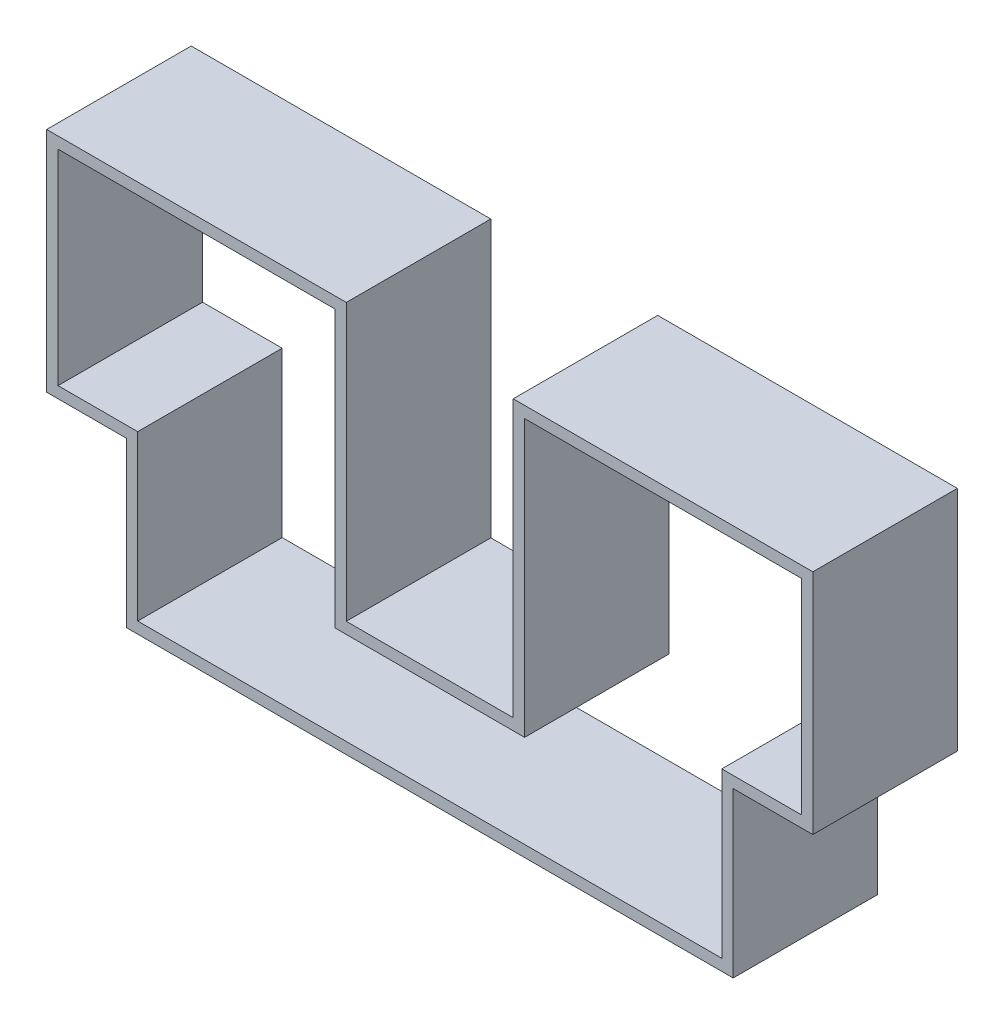
ISO-10303-21;
HEADER;
FILE_DESCRIPTION(('STEP AP214'),'2;1');
FILE_NAME('part.step','',(''),(''),'','','');
FILE_SCHEMA(('AUTOMOTIVE_DESIGN { 1 0 10303 214 1 1 1 1 }'));
ENDSEC;
DATA;
#1=APPLICATION_CONTEXT('core data for automotive mechanical design processes');
#2=APPLICATION_PROTOCOL_DEFINITION('international standard','automotive_design',2000,#1);
#3=PRODUCT_CONTEXT('',#1,'mechanical');
#4=PRODUCT('Part','Part','',(#3));
#5=PRODUCT_RELATED_PRODUCT_CATEGORY('part','',(#4));
#6=PRODUCT_DEFINITION_FORMATION('','',#4);
#7=PRODUCT_DEFINITION_CONTEXT('part definition',#1,'design');
#8=PRODUCT_DEFINITION('design','',#6,#7);
#9=PRODUCT_DEFINITION_SHAPE('','',#8);
#10=(LENGTH_UNIT() NAMED_UNIT(*) SI_UNIT(.MILLI.,.METRE.));
#11=(NAMED_UNIT(*) PLANE_ANGLE_UNIT() SI_UNIT($,.RADIAN.));
#12=(NAMED_UNIT(*) SI_UNIT($,.STERADIAN.) SOLID_ANGLE_UNIT());
#13=UNCERTAINTY_MEASURE_WITH_UNIT(LENGTH_MEASURE(1.E-05),#10,'distance_accuracy_value','');
#14=(GEOMETRIC_REPRESENTATION_CONTEXT(3) GLOBAL_UNCERTAINTY_ASSIGNED_CONTEXT((#13)) GLOBAL_UNIT_ASSIGNED_CONTEXT((#10,
#11,#12)) REPRESENTATION_CONTEXT('',''));
#15=CARTESIAN_POINT('',(0.,0.,0.));
#16=DIRECTION('',(0.,0.,1.));
#17=DIRECTION('',(1.,0.,0.));
#18=AXIS2_PLACEMENT_3D('',#15,#16,#17);
#19=CARTESIAN_POINT('',(0.,0.,38.1));
#20=DIRECTION('',(0.,0.,-1.));
#21=DIRECTION('',(-1.,0.,0.));
#22=AXIS2_PLACEMENT_3D('',#19,#20,#21);
#23=PLANE('',#22);
#24=DIRECTION('',(0.,1.,0.));
#25=VECTOR('',#24,1.);
#26=CARTESIAN_POINT('',(80.,0.,38.1));
#27=LINE('',#26,#25);
#28=CARTESIAN_POINT('',(80.,0.,38.1));
#29=VERTEX_POINT('',#28);
#30=CARTESIAN_POINT('',(80.,43.25,38.1));
#31=VERTEX_POINT('',#30);
#32=EDGE_CURVE('E271',#29,#31,#27,.T.);
#33=ORIENTED_EDGE('',*,*,#32,.T.);
#34=DIRECTION('',(1.,0.,0.));
#35=VECTOR('',#34,1.);
#36=CARTESIAN_POINT('',(80.,43.25,38.1));
#37=LINE('',#36,#35);
#38=CARTESIAN_POINT('',(101.,43.25,38.1));
#39=VERTEX_POINT('',#38);
#40=EDGE_CURVE('E274',#31,#39,#37,.T.);
#41=ORIENTED_EDGE('',*,*,#40,.T.);
#42=DIRECTION('',(0.,1.,0.));
#43=VECTOR('',#42,1.);
#44=CARTESIAN_POINT('',(101.,43.25,38.1));
#45=LINE('',#44,#43);
#46=CARTESIAN_POINT('',(101.,103.25,38.1));
#47=VERTEX_POINT('',#46);
#48=EDGE_CURVE('E277',#39,#47,#45,.T.);
#49=ORIENTED_EDGE('',*,*,#48,.T.);
#50=DIRECTION('',(-1.,0.,0.));
#51=VECTOR('',#50,1.);
#52=CARTESIAN_POINT('',(101.,103.25,38.1));
#53=LINE('',#52,#51);
#54=CARTESIAN_POINT('',(22.006,103.25,38.1));
#55=VERTEX_POINT('',#54);
#56=EDGE_CURVE('E279',#47,#55,#53,.T.);
#57=ORIENTED_EDGE('',*,*,#56,.T.);
#58=DIRECTION('',(0.,-1.,0.));
#59=VECTOR('',#58,1.);
#60=CARTESIAN_POINT('',(22.006,103.25,38.1));
#61=LINE('',#60,#59);
#62=CARTESIAN_POINT('',(22.006,30.4414836809851,38.1));
#63=VERTEX_POINT('',#62);
#64=EDGE_CURVE('E281',#55,#63,#61,.T.);
#65=ORIENTED_EDGE('',*,*,#64,.T.);
#66=DIRECTION('',(-1.,0.,0.));
#67=VECTOR('',#66,1.);
#68=CARTESIAN_POINT('',(-22.006,30.4414836809851,38.1));
#69=LINE('',#68,#67);
#70=CARTESIAN_POINT('',(-22.006,30.4414836809851,38.1));
#71=VERTEX_POINT('',#70);
#72=EDGE_CURVE('E283',#63,#71,#69,.T.);
#73=ORIENTED_EDGE('',*,*,#72,.T.);
#74=DIRECTION('',(0.,1.,0.));
#75=VECTOR('',#74,1.);
#76=CARTESIAN_POINT('',(-22.006,103.25,38.1));
#77=LINE('',#76,#75);
#78=CARTESIAN_POINT('',(-22.006,103.25,38.1));
#79=VERTEX_POINT('',#78);
#80=EDGE_CURVE('E285',#71,#79,#77,.T.);
#81=ORIENTED_EDGE('',*,*,#80,.T.);
#82=DIRECTION('',(-1.,0.,0.));
#83=VECTOR('',#82,1.);
#84=CARTESIAN_POINT('',(-101.,103.25,38.1));
#85=LINE('',#84,#83);
#86=CARTESIAN_POINT('',(-101.,103.25,38.1));
#87=VERTEX_POINT('',#86);
#88=EDGE_CURVE('E287',#79,#87,#85,.T.);
#89=ORIENTED_EDGE('',*,*,#88,.T.);
#90=DIRECTION('',(0.,-1.,0.));
#91=VECTOR('',#90,1.);
#92=CARTESIAN_POINT('',(-101.,43.25,38.1));
#93=LINE('',#92,#91);
#94=CARTESIAN_POINT('',(-101.,43.25,38.1));
#95=VERTEX_POINT('',#94);
#96=EDGE_CURVE('E289',#87,#95,#93,.T.);
#97=ORIENTED_EDGE('',*,*,#96,.T.);
#98=DIRECTION('',(1.,0.,0.));
#99=VECTOR('',#98,1.);
#100=CARTESIAN_POINT('',(-80.,43.25,38.1));
#101=LINE('',#100,#99);
#102=CARTESIAN_POINT('',(-80.,43.25,38.1));
#103=VERTEX_POINT('',#102);
#104=EDGE_CURVE('E291',#95,#103,#101,.T.);
#105=ORIENTED_EDGE('',*,*,#104,.T.);
#106=DIRECTION('',(0.,-1.,0.));
#107=VECTOR('',#106,1.);
#108=CARTESIAN_POINT('',(-80.,0.,38.1));
#109=LINE('',#108,#107);
#110=CARTESIAN_POINT('',(-80.,0.,38.1));
#111=VERTEX_POINT('',#110);
#112=EDGE_CURVE('E293',#103,#111,#109,.T.);
#113=ORIENTED_EDGE('',*,*,#112,.T.);
#114=DIRECTION('',(1.,0.,0.));
#115=VECTOR('',#114,1.);
#116=CARTESIAN_POINT('',(80.,0.,38.1));
#117=LINE('',#116,#115);
#118=EDGE_CURVE('E295',#111,#29,#117,.T.);
#119=ORIENTED_EDGE('',*,*,#118,.T.);
#120=EDGE_LOOP('',(#33,#41,#49,#57,#65,#73,#81,#89,#97,#105,#113,#119));
#121=FACE_BOUND('',#120,.T.);
#122=DIRECTION('',(0.,1.,0.));
#123=VECTOR('',#122,1.);
#124=CARTESIAN_POINT('',(77.,0.,38.1));
#125=LINE('',#124,#123);
#126=CARTESIAN_POINT('',(77.,3.00000000000003,38.1));
#127=VERTEX_POINT('',#126);
#128=CARTESIAN_POINT('',(77.,46.25,38.1));
#129=VERTEX_POINT('',#128);
#130=EDGE_CURVE('E222',#127,#129,#125,.T.);
#131=ORIENTED_EDGE('',*,*,#130,.F.);
#132=DIRECTION('',(1.,0.,0.));
#133=VECTOR('',#132,1.);
#134=CARTESIAN_POINT('',(0.,3.,38.1));
#135=LINE('',#134,#133);
#136=CARTESIAN_POINT('',(-77.,2.99999999999998,38.1));
#137=VERTEX_POINT('',#136);
#138=EDGE_CURVE('E204',#137,#127,#135,.T.);
#139=ORIENTED_EDGE('',*,*,#138,.F.);
#140=DIRECTION('',(0.,-1.,0.));
#141=VECTOR('',#140,1.);
#142=CARTESIAN_POINT('',(-77.,0.,38.1));
#143=LINE('',#142,#141);
#144=CARTESIAN_POINT('',(-77.,46.25,38.1));
#145=VERTEX_POINT('',#144);
#146=EDGE_CURVE('E268',#145,#137,#143,.T.);
#147=ORIENTED_EDGE('',*,*,#146,.F.);
#148=DIRECTION('',(1.,0.,0.));
#149=VECTOR('',#148,1.);
#150=CARTESIAN_POINT('',(0.,46.25,38.1));
#151=LINE('',#150,#149);
#152=CARTESIAN_POINT('',(-98.,46.25,38.1));
#153=VERTEX_POINT('',#152);
#154=EDGE_CURVE('E266',#153,#145,#151,.T.);
#155=ORIENTED_EDGE('',*,*,#154,.F.);
#156=DIRECTION('',(0.,-1.,0.));
#157=VECTOR('',#156,1.);
#158=CARTESIAN_POINT('',(-98.,0.,38.1));
#159=LINE('',#158,#157);
#160=CARTESIAN_POINT('',(-98.,100.25,38.1));
#161=VERTEX_POINT('',#160);
#162=EDGE_CURVE('E264',#161,#153,#159,.T.);
#163=ORIENTED_EDGE('',*,*,#162,.F.);
#164=DIRECTION('',(-1.,0.,0.));
#165=VECTOR('',#164,1.);
#166=CARTESIAN_POINT('',(0.,100.25,38.1));
#167=LINE('',#166,#165);
#168=CARTESIAN_POINT('',(-25.006,100.25,38.1));
#169=VERTEX_POINT('',#168);
#170=EDGE_CURVE('E262',#169,#161,#167,.T.);
#171=ORIENTED_EDGE('',*,*,#170,.F.);
#172=DIRECTION('',(0.,1.,0.));
#173=VECTOR('',#172,1.);
#174=CARTESIAN_POINT('',(-25.006,0.,38.1));
#175=LINE('',#174,#173);
#176=CARTESIAN_POINT('',(-25.006,27.4414836809851,38.1));
#177=VERTEX_POINT('',#176);
#178=EDGE_CURVE('E260',#177,#169,#175,.T.);
#179=ORIENTED_EDGE('',*,*,#178,.F.);
#180=DIRECTION('',(-1.,0.,0.));
#181=VECTOR('',#180,1.);
#182=CARTESIAN_POINT('',(0.,27.4414836809851,38.1));
#183=LINE('',#182,#181);
#184=CARTESIAN_POINT('',(25.006,27.4414836809851,38.1));
#185=VERTEX_POINT('',#184);
#186=EDGE_CURVE('E258',#185,#177,#183,.T.);
#187=ORIENTED_EDGE('',*,*,#186,.F.);
#188=DIRECTION('',(0.,-1.,0.));
#189=VECTOR('',#188,1.);
#190=CARTESIAN_POINT('',(25.006,0.,38.1));
#191=LINE('',#190,#189);
#192=CARTESIAN_POINT('',(25.006,100.25,38.1));
#193=VERTEX_POINT('',#192);
#194=EDGE_CURVE('E256',#193,#185,#191,.T.);
#195=ORIENTED_EDGE('',*,*,#194,.F.);
#196=DIRECTION('',(-1.,0.,0.));
#197=VECTOR('',#196,1.);
#198=CARTESIAN_POINT('',(0.,100.25,38.1));
#199=LINE('',#198,#197);
#200=CARTESIAN_POINT('',(98.,100.25,38.1));
#201=VERTEX_POINT('',#200);
#202=EDGE_CURVE('E254',#201,#193,#199,.T.);
#203=ORIENTED_EDGE('',*,*,#202,.F.);
#204=DIRECTION('',(0.,1.,0.));
#205=VECTOR('',#204,1.);
#206=CARTESIAN_POINT('',(98.,0.,38.1));
#207=LINE('',#206,#205);
#208=CARTESIAN_POINT('',(98.,46.25,38.1));
#209=VERTEX_POINT('',#208);
#210=EDGE_CURVE('E252',#209,#201,#207,.T.);
#211=ORIENTED_EDGE('',*,*,#210,.F.);
#212=DIRECTION('',(1.,0.,0.));
#213=VECTOR('',#212,1.);
#214=CARTESIAN_POINT('',(0.,46.25,38.1));
#215=LINE('',#214,#213);
#216=EDGE_CURVE('E224',#129,#209,#215,.T.);
#217=ORIENTED_EDGE('',*,*,#216,.F.);
#218=EDGE_LOOP('',(#131,#139,#147,#155,#163,#171,#179,#187,#195,#203,#211,#217));
#219=FACE_BOUND('',#218,.T.);
#220=ADVANCED_FACE('F37',(#121,#219),#23,.F.);
#221=CARTESIAN_POINT('',(0.,0.,0.));
#222=DIRECTION('',(0.,0.,-1.));
#223=DIRECTION('',(-1.,0.,0.));
#224=AXIS2_PLACEMENT_3D('',#221,#222,#223);
#225=PLANE('',#224);
#226=DIRECTION('',(0.,1.,0.));
#227=VECTOR('',#226,1.);
#228=CARTESIAN_POINT('',(80.,0.,0.));
#229=LINE('',#228,#227);
#230=CARTESIAN_POINT('',(80.,0.,0.));
#231=VERTEX_POINT('',#230);
#232=CARTESIAN_POINT('',(80.,43.25,0.));
#233=VERTEX_POINT('',#232);
#234=EDGE_CURVE('E298',#231,#233,#229,.T.);
#235=ORIENTED_EDGE('',*,*,#234,.F.);
#236=DIRECTION('',(1.,0.,0.));
#237=VECTOR('',#236,1.);
#238=CARTESIAN_POINT('',(80.,0.,0.));
#239=LINE('',#238,#237);
#240=CARTESIAN_POINT('',(-80.,0.,0.));
#241=VERTEX_POINT('',#240);
#242=EDGE_CURVE('E275',#241,#231,#239,.T.);
#243=ORIENTED_EDGE('',*,*,#242,.F.);
#244=DIRECTION('',(0.,-1.,0.));
#245=VECTOR('',#244,1.);
#246=CARTESIAN_POINT('',(-80.,0.,0.));
#247=LINE('',#246,#245);
#248=CARTESIAN_POINT('',(-80.,43.25,0.));
#249=VERTEX_POINT('',#248);
#250=EDGE_CURVE('E319',#249,#241,#247,.T.);
#251=ORIENTED_EDGE('',*,*,#250,.F.);
#252=DIRECTION('',(1.,0.,0.));
#253=VECTOR('',#252,1.);
#254=CARTESIAN_POINT('',(-80.,43.25,0.));
#255=LINE('',#254,#253);
#256=CARTESIAN_POINT('',(-101.,43.25,0.));
#257=VERTEX_POINT('',#256);
#258=EDGE_CURVE('E317',#257,#249,#255,.T.);
#259=ORIENTED_EDGE('',*,*,#258,.F.);
#260=DIRECTION('',(0.,-1.,0.));
#261=VECTOR('',#260,1.);
#262=CARTESIAN_POINT('',(-101.,43.25,0.));
#263=LINE('',#262,#261);
#264=CARTESIAN_POINT('',(-101.,103.25,0.));
#265=VERTEX_POINT('',#264);
#266=EDGE_CURVE('E315',#265,#257,#263,.T.);
#267=ORIENTED_EDGE('',*,*,#266,.F.);
#268=DIRECTION('',(-1.,0.,0.));
#269=VECTOR('',#268,1.);
#270=CARTESIAN_POINT('',(-101.,103.25,0.));
#271=LINE('',#270,#269);
#272=CARTESIAN_POINT('',(-22.006,103.25,0.));
#273=VERTEX_POINT('',#272);
#274=EDGE_CURVE('E313',#273,#265,#271,.T.);
#275=ORIENTED_EDGE('',*,*,#274,.F.);
#276=DIRECTION('',(0.,1.,0.));
#277=VECTOR('',#276,1.);
#278=CARTESIAN_POINT('',(-22.006,103.25,0.));
#279=LINE('',#278,#277);
#280=CARTESIAN_POINT('',(-22.006,30.4414836809851,0.));
#281=VERTEX_POINT('',#280);
#282=EDGE_CURVE('E311',#281,#273,#279,.T.);
#283=ORIENTED_EDGE('',*,*,#282,.F.);
#284=DIRECTION('',(-1.,0.,0.));
#285=VECTOR('',#284,1.);
#286=CARTESIAN_POINT('',(-22.006,30.4414836809851,0.));
#287=LINE('',#286,#285);
#288=CARTESIAN_POINT('',(22.006,30.4414836809851,0.));
#289=VERTEX_POINT('',#288);
#290=EDGE_CURVE('E309',#289,#281,#287,.T.);
#291=ORIENTED_EDGE('',*,*,#290,.F.);
#292=DIRECTION('',(0.,-1.,0.));
#293=VECTOR('',#292,1.);
#294=CARTESIAN_POINT('',(22.006,103.25,0.));
#295=LINE('',#294,#293);
#296=CARTESIAN_POINT('',(22.006,103.25,0.));
#297=VERTEX_POINT('',#296);
#298=EDGE_CURVE('E307',#297,#289,#295,.T.);
#299=ORIENTED_EDGE('',*,*,#298,.F.);
#300=DIRECTION('',(-1.,0.,0.));
#301=VECTOR('',#300,1.);
#302=CARTESIAN_POINT('',(101.,103.25,0.));
#303=LINE('',#302,#301);
#304=CARTESIAN_POINT('',(101.,103.25,0.));
#305=VERTEX_POINT('',#304);
#306=EDGE_CURVE('E305',#305,#297,#303,.T.);
#307=ORIENTED_EDGE('',*,*,#306,.F.);
#308=DIRECTION('',(0.,1.,0.));
#309=VECTOR('',#308,1.);
#310=CARTESIAN_POINT('',(101.,43.25,0.));
#311=LINE('',#310,#309);
#312=CARTESIAN_POINT('',(101.,43.25,0.));
#313=VERTEX_POINT('',#312);
#314=EDGE_CURVE('E303',#313,#305,#311,.T.);
#315=ORIENTED_EDGE('',*,*,#314,.F.);
#316=DIRECTION('',(1.,0.,0.));
#317=VECTOR('',#316,1.);
#318=CARTESIAN_POINT('',(80.,43.25,0.));
#319=LINE('',#318,#317);
#320=EDGE_CURVE('E301',#233,#313,#319,.T.);
#321=ORIENTED_EDGE('',*,*,#320,.F.);
#322=EDGE_LOOP('',(#235,#243,#251,#259,#267,#275,#283,#291,#299,#307,#315,#321));
#323=FACE_BOUND('',#322,.T.);
#324=DIRECTION('',(1.,0.,0.));
#325=VECTOR('',#324,1.);
#326=CARTESIAN_POINT('',(0.,3.,0.));
#327=LINE('',#326,#325);
#328=CARTESIAN_POINT('',(-77.,2.99999999999998,0.));
#329=VERTEX_POINT('',#328);
#330=CARTESIAN_POINT('',(77.,3.00000000000003,0.));
#331=VERTEX_POINT('',#330);
#332=EDGE_CURVE('E201',#329,#331,#327,.T.);
#333=ORIENTED_EDGE('',*,*,#332,.T.);
#334=DIRECTION('',(0.,1.,0.));
#335=VECTOR('',#334,1.);
#336=CARTESIAN_POINT('',(77.,0.,0.));
#337=LINE('',#336,#335);
#338=CARTESIAN_POINT('',(77.,46.25,0.));
#339=VERTEX_POINT('',#338);
#340=EDGE_CURVE('E210',#331,#339,#337,.T.);
#341=ORIENTED_EDGE('',*,*,#340,.T.);
#342=DIRECTION('',(1.,0.,0.));
#343=VECTOR('',#342,1.);
#344=CARTESIAN_POINT('',(0.,46.25,0.));
#345=LINE('',#344,#343);
#346=CARTESIAN_POINT('',(98.,46.25,0.));
#347=VERTEX_POINT('',#346);
#348=EDGE_CURVE('E216',#339,#347,#345,.T.);
#349=ORIENTED_EDGE('',*,*,#348,.T.);
#350=DIRECTION('',(0.,1.,0.));
#351=VECTOR('',#350,1.);
#352=CARTESIAN_POINT('',(98.,0.,0.));
#353=LINE('',#352,#351);
#354=CARTESIAN_POINT('',(98.,100.25,0.));
#355=VERTEX_POINT('',#354);
#356=EDGE_CURVE('E60',#347,#355,#353,.T.);
#357=ORIENTED_EDGE('',*,*,#356,.T.);
#358=DIRECTION('',(-1.,0.,0.));
#359=VECTOR('',#358,1.);
#360=CARTESIAN_POINT('',(0.,100.25,0.));
#361=LINE('',#360,#359);
#362=CARTESIAN_POINT('',(25.006,100.25,0.));
#363=VERTEX_POINT('',#362);
#364=EDGE_CURVE('E246',#355,#363,#361,.T.);
#365=ORIENTED_EDGE('',*,*,#364,.T.);
#366=DIRECTION('',(0.,-1.,0.));
#367=VECTOR('',#366,1.);
#368=CARTESIAN_POINT('',(25.006,0.,0.));
#369=LINE('',#368,#367);
#370=CARTESIAN_POINT('',(25.006,27.4414836809851,0.));
#371=VERTEX_POINT('',#370);
#372=EDGE_CURVE('E243',#363,#371,#369,.T.);
#373=ORIENTED_EDGE('',*,*,#372,.T.);
#374=DIRECTION('',(-1.,0.,0.));
#375=VECTOR('',#374,1.);
#376=CARTESIAN_POINT('',(0.,27.4414836809851,0.));
#377=LINE('',#376,#375);
#378=CARTESIAN_POINT('',(-25.006,27.4414836809851,0.));
#379=VERTEX_POINT('',#378);
#380=EDGE_CURVE('E240',#371,#379,#377,.T.);
#381=ORIENTED_EDGE('',*,*,#380,.T.);
#382=DIRECTION('',(0.,1.,0.));
#383=VECTOR('',#382,1.);
#384=CARTESIAN_POINT('',(-25.006,0.,0.));
#385=LINE('',#384,#383);
#386=CARTESIAN_POINT('',(-25.006,100.25,0.));
#387=VERTEX_POINT('',#386);
#388=EDGE_CURVE('E237',#379,#387,#385,.T.);
#389=ORIENTED_EDGE('',*,*,#388,.T.);
#390=DIRECTION('',(-1.,0.,0.));
#391=VECTOR('',#390,1.);
#392=CARTESIAN_POINT('',(0.,100.25,0.));
#393=LINE('',#392,#391);
#394=CARTESIAN_POINT('',(-98.,100.25,0.));
#395=VERTEX_POINT('',#394);
#396=EDGE_CURVE('E234',#387,#395,#393,.T.);
#397=ORIENTED_EDGE('',*,*,#396,.T.);
#398=DIRECTION('',(0.,-1.,0.));
#399=VECTOR('',#398,1.);
#400=CARTESIAN_POINT('',(-98.,0.,0.));
#401=LINE('',#400,#399);
#402=CARTESIAN_POINT('',(-98.,46.25,0.));
#403=VERTEX_POINT('',#402);
#404=EDGE_CURVE('E231',#395,#403,#401,.T.);
#405=ORIENTED_EDGE('',*,*,#404,.T.);
#406=DIRECTION('',(1.,0.,0.));
#407=VECTOR('',#406,1.);
#408=CARTESIAN_POINT('',(0.,46.25,0.));
#409=LINE('',#408,#407);
#410=CARTESIAN_POINT('',(-77.,46.25,0.));
#411=VERTEX_POINT('',#410);
#412=EDGE_CURVE('E226',#403,#411,#409,.T.);
#413=ORIENTED_EDGE('',*,*,#412,.T.);
#414=DIRECTION('',(0.,-1.,0.));
#415=VECTOR('',#414,1.);
#416=CARTESIAN_POINT('',(-77.,0.,0.));
#417=LINE('',#416,#415);
#418=EDGE_CURVE('E221',#411,#329,#417,.T.);
#419=ORIENTED_EDGE('',*,*,#418,.T.);
#420=EDGE_LOOP('',(#333,#341,#349,#357,#365,#373,#381,#389,#397,#405,#413,#419));
#421=FACE_BOUND('',#420,.T.);
#422=ADVANCED_FACE('F218',(#323,#421),#225,.T.);
#423=CARTESIAN_POINT('',(80.,0.,38.1));
#424=DIRECTION('',(-1.,0.,0.));
#425=DIRECTION('',(0.,0.,1.));
#426=AXIS2_PLACEMENT_3D('',#423,#424,#425);
#427=PLANE('',#426);
#428=ORIENTED_EDGE('',*,*,#234,.T.);
#429=DIRECTION('',(0.,0.,-1.));
#430=VECTOR('',#429,1.);
#431=CARTESIAN_POINT('',(80.,43.25,38.1));
#432=LINE('',#431,#430);
#433=EDGE_CURVE('E11',#31,#233,#432,.T.);
#434=ORIENTED_EDGE('',*,*,#433,.F.);
#435=ORIENTED_EDGE('',*,*,#32,.F.);
#436=DIRECTION('',(0.,0.,-1.));
#437=VECTOR('',#436,1.);
#438=CARTESIAN_POINT('',(80.,0.,38.1));
#439=LINE('',#438,#437);
#440=EDGE_CURVE('E297',#29,#231,#439,.T.);
#441=ORIENTED_EDGE('',*,*,#440,.T.);
#442=EDGE_LOOP('',(#428,#434,#435,#441));
#443=FACE_BOUND('',#442,.T.);
#444=ADVANCED_FACE('F39',(#443),#427,.F.);
#445=CARTESIAN_POINT('',(80.,43.25,38.1));
#446=DIRECTION('',(0.,1.,0.));
#447=DIRECTION('',(0.,0.,1.));
#448=AXIS2_PLACEMENT_3D('',#445,#446,#447);
#449=PLANE('',#448);
#450=ORIENTED_EDGE('',*,*,#320,.T.);
#451=DIRECTION('',(0.,0.,-1.));
#452=VECTOR('',#451,1.);
#453=CARTESIAN_POINT('',(101.,43.25,38.1));
#454=LINE('',#453,#452);
#455=EDGE_CURVE('E45',#39,#313,#454,.T.);
#456=ORIENTED_EDGE('',*,*,#455,.F.);
#457=ORIENTED_EDGE('',*,*,#40,.F.);
#458=ORIENTED_EDGE('',*,*,#433,.T.);
#459=EDGE_LOOP('',(#450,#456,#457,#458));
#460=FACE_BOUND('',#459,.T.);
#461=ADVANCED_FACE('F377',(#460),#449,.F.);
#462=CARTESIAN_POINT('',(101.,43.25,38.1));
#463=DIRECTION('',(-1.,0.,0.));
#464=DIRECTION('',(0.,0.,1.));
#465=AXIS2_PLACEMENT_3D('',#462,#463,#464);
#466=PLANE('',#465);
#467=ORIENTED_EDGE('',*,*,#314,.T.);
#468=DIRECTION('',(0.,0.,-1.));
#469=VECTOR('',#468,1.);
#470=CARTESIAN_POINT('',(101.,103.25,38.1));
#471=LINE('',#470,#469);
#472=EDGE_CURVE('E348',#47,#305,#471,.T.);
#473=ORIENTED_EDGE('',*,*,#472,.F.);
#474=ORIENTED_EDGE('',*,*,#48,.F.);
#475=ORIENTED_EDGE('',*,*,#455,.T.);
#476=EDGE_LOOP('',(#467,#473,#474,#475));
#477=FACE_BOUND('',#476,.T.);
#478=ADVANCED_FACE('F355',(#477),#466,.F.);
#479=CARTESIAN_POINT('',(101.,103.25,38.1));
#480=DIRECTION('',(0.,-1.,0.));
#481=DIRECTION('',(0.,0.,-1.));
#482=AXIS2_PLACEMENT_3D('',#479,#480,#481);
#483=PLANE('',#482);
#484=ORIENTED_EDGE('',*,*,#306,.T.);
#485=DIRECTION('',(0.,0.,-1.));
#486=VECTOR('',#485,1.);
#487=CARTESIAN_POINT('',(22.006,103.25,38.1));
#488=LINE('',#487,#486);
#489=EDGE_CURVE('E345',#55,#297,#488,.T.);
#490=ORIENTED_EDGE('',*,*,#489,.F.);
#491=ORIENTED_EDGE('',*,*,#56,.F.);
#492=ORIENTED_EDGE('',*,*,#472,.T.);
#493=EDGE_LOOP('',(#484,#490,#491,#492));
#494=FACE_BOUND('',#493,.T.);
#495=ADVANCED_FACE('F365',(#494),#483,.F.);
#496=CARTESIAN_POINT('',(22.006,103.25,38.1));
#497=DIRECTION('',(1.,0.,0.));
#498=DIRECTION('',(0.,0.,-1.));
#499=AXIS2_PLACEMENT_3D('',#496,#497,#498);
#500=PLANE('',#499);
#501=ORIENTED_EDGE('',*,*,#298,.T.);
#502=DIRECTION('',(0.,0.,-1.));
#503=VECTOR('',#502,1.);
#504=CARTESIAN_POINT('',(22.006,30.4414836809851,38.1));
#505=LINE('',#504,#503);
#506=EDGE_CURVE('E342',#63,#289,#505,.T.);
#507=ORIENTED_EDGE('',*,*,#506,.F.);
#508=ORIENTED_EDGE('',*,*,#64,.F.);
#509=ORIENTED_EDGE('',*,*,#489,.T.);
#510=EDGE_LOOP('',(#501,#507,#508,#509));
#511=FACE_BOUND('',#510,.T.);
#512=ADVANCED_FACE('F369',(#511),#500,.F.);
#513=CARTESIAN_POINT('',(-22.006,30.4414836809851,38.1));
#514=DIRECTION('',(0.,-1.,0.));
#515=DIRECTION('',(0.,0.,-1.));
#516=AXIS2_PLACEMENT_3D('',#513,#514,#515);
#517=PLANE('',#516);
#518=ORIENTED_EDGE('',*,*,#290,.T.);
#519=DIRECTION('',(0.,0.,-1.));
#520=VECTOR('',#519,1.);
#521=CARTESIAN_POINT('',(-22.006,30.4414836809851,38.1));
#522=LINE('',#521,#520);
#523=EDGE_CURVE('E339',#71,#281,#522,.T.);
#524=ORIENTED_EDGE('',*,*,#523,.F.);
#525=ORIENTED_EDGE('',*,*,#72,.F.);
#526=ORIENTED_EDGE('',*,*,#506,.T.);
#527=EDGE_LOOP('',(#518,#524,#525,#526));
#528=FACE_BOUND('',#527,.T.);
#529=ADVANCED_FACE('F410',(#528),#517,.F.);
#530=CARTESIAN_POINT('',(-22.006,103.25,38.1));
#531=DIRECTION('',(-1.,0.,0.));
#532=DIRECTION('',(0.,0.,1.));
#533=AXIS2_PLACEMENT_3D('',#530,#531,#532);
#534=PLANE('',#533);
#535=ORIENTED_EDGE('',*,*,#282,.T.);
#536=DIRECTION('',(0.,0.,-1.));
#537=VECTOR('',#536,1.);
#538=CARTESIAN_POINT('',(-22.006,103.25,38.1));
#539=LINE('',#538,#537);
#540=EDGE_CURVE('E336',#79,#273,#539,.T.);
#541=ORIENTED_EDGE('',*,*,#540,.F.);
#542=ORIENTED_EDGE('',*,*,#80,.F.);
#543=ORIENTED_EDGE('',*,*,#523,.T.);
#544=EDGE_LOOP('',(#535,#541,#542,#543));
#545=FACE_BOUND('',#544,.T.);
#546=ADVANCED_FACE('F408',(#545),#534,.F.);
#547=CARTESIAN_POINT('',(-101.,103.25,38.1));
#548=DIRECTION('',(0.,-1.,0.));
#549=DIRECTION('',(0.,0.,-1.));
#550=AXIS2_PLACEMENT_3D('',#547,#548,#549);
#551=PLANE('',#550);
#552=ORIENTED_EDGE('',*,*,#274,.T.);
#553=DIRECTION('',(0.,0.,-1.));
#554=VECTOR('',#553,1.);
#555=CARTESIAN_POINT('',(-101.,103.25,38.1));
#556=LINE('',#555,#554);
#557=EDGE_CURVE('E333',#87,#265,#556,.T.);
#558=ORIENTED_EDGE('',*,*,#557,.F.);
#559=ORIENTED_EDGE('',*,*,#88,.F.);
#560=ORIENTED_EDGE('',*,*,#540,.T.);
#561=EDGE_LOOP('',(#552,#558,#559,#560));
#562=FACE_BOUND('',#561,.T.);
#563=ADVANCED_FACE('F404',(#562),#551,.F.);
#564=CARTESIAN_POINT('',(-101.,43.25,38.1));
#565=DIRECTION('',(1.,0.,0.));
#566=DIRECTION('',(0.,0.,-1.));
#567=AXIS2_PLACEMENT_3D('',#564,#565,#566);
#568=PLANE('',#567);
#569=ORIENTED_EDGE('',*,*,#266,.T.);
#570=DIRECTION('',(0.,0.,-1.));
#571=VECTOR('',#570,1.);
#572=CARTESIAN_POINT('',(-101.,43.25,38.1));
#573=LINE('',#572,#571);
#574=EDGE_CURVE('E330',#95,#257,#573,.T.);
#575=ORIENTED_EDGE('',*,*,#574,.F.);
#576=ORIENTED_EDGE('',*,*,#96,.F.);
#577=ORIENTED_EDGE('',*,*,#557,.T.);
#578=EDGE_LOOP('',(#569,#575,#576,#577));
#579=FACE_BOUND('',#578,.T.);
#580=ADVANCED_FACE('F399',(#579),#568,.F.);
#581=CARTESIAN_POINT('',(-80.,43.25,38.1));
#582=DIRECTION('',(0.,1.,0.));
#583=DIRECTION('',(0.,0.,1.));
#584=AXIS2_PLACEMENT_3D('',#581,#582,#583);
#585=PLANE('',#584);
#586=ORIENTED_EDGE('',*,*,#258,.T.);
#587=DIRECTION('',(0.,0.,-1.));
#588=VECTOR('',#587,1.);
#589=CARTESIAN_POINT('',(-80.,43.25,38.1));
#590=LINE('',#589,#588);
#591=EDGE_CURVE('E327',#103,#249,#590,.T.);
#592=ORIENTED_EDGE('',*,*,#591,.F.);
#593=ORIENTED_EDGE('',*,*,#104,.F.);
#594=ORIENTED_EDGE('',*,*,#574,.T.);
#595=EDGE_LOOP('',(#586,#592,#593,#594));
#596=FACE_BOUND('',#595,.T.);
#597=ADVANCED_FACE('F393',(#596),#585,.F.);
#598=CARTESIAN_POINT('',(-80.,0.,38.1));
#599=DIRECTION('',(1.,0.,0.));
#600=DIRECTION('',(0.,0.,-1.));
#601=AXIS2_PLACEMENT_3D('',#598,#599,#600);
#602=PLANE('',#601);
#603=ORIENTED_EDGE('',*,*,#250,.T.);
#604=DIRECTION('',(0.,0.,-1.));
#605=VECTOR('',#604,1.);
#606=CARTESIAN_POINT('',(-80.,0.,38.1));
#607=LINE('',#606,#605);
#608=EDGE_CURVE('E324',#111,#241,#607,.T.);
#609=ORIENTED_EDGE('',*,*,#608,.F.);
#610=ORIENTED_EDGE('',*,*,#112,.F.);
#611=ORIENTED_EDGE('',*,*,#591,.T.);
#612=EDGE_LOOP('',(#603,#609,#610,#611));
#613=FACE_BOUND('',#612,.T.);
#614=ADVANCED_FACE('F389',(#613),#602,.F.);
#615=CARTESIAN_POINT('',(80.,0.,38.1));
#616=DIRECTION('',(0.,1.,0.));
#617=DIRECTION('',(-1.,0.,0.));
#618=AXIS2_PLACEMENT_3D('',#615,#616,#617);
#619=PLANE('',#618);
#620=ORIENTED_EDGE('',*,*,#242,.T.);
#621=ORIENTED_EDGE('',*,*,#440,.F.);
#622=ORIENTED_EDGE('',*,*,#118,.F.);
#623=ORIENTED_EDGE('',*,*,#608,.T.);
#624=EDGE_LOOP('',(#620,#621,#622,#623));
#625=FACE_BOUND('',#624,.T.);
#626=ADVANCED_FACE('F384',(#625),#619,.F.);
#627=CARTESIAN_POINT('',(77.,0.,38.1));
#628=DIRECTION('',(-1.,0.,0.));
#629=DIRECTION('',(0.,0.,1.));
#630=AXIS2_PLACEMENT_3D('',#627,#628,#629);
#631=PLANE('',#630);
#632=ORIENTED_EDGE('',*,*,#340,.F.);
#633=DIRECTION('',(0.,0.,-1.));
#634=VECTOR('',#633,1.);
#635=CARTESIAN_POINT('',(77.,3.00000000000003,38.1));
#636=LINE('',#635,#634);
#637=EDGE_CURVE('E197',#127,#331,#636,.T.);
#638=ORIENTED_EDGE('',*,*,#637,.F.);
#639=ORIENTED_EDGE('',*,*,#130,.T.);
#640=DIRECTION('',(0.,0.,-1.));
#641=VECTOR('',#640,1.);
#642=CARTESIAN_POINT('',(77.,46.25,38.1));
#643=LINE('',#642,#641);
#644=EDGE_CURVE('E213',#129,#339,#643,.T.);
#645=ORIENTED_EDGE('',*,*,#644,.T.);
#646=EDGE_LOOP('',(#632,#638,#639,#645));
#647=FACE_BOUND('',#646,.T.);
#648=ADVANCED_FACE('F211',(#647),#631,.T.);
#649=CARTESIAN_POINT('',(80.,46.25,38.1));
#650=DIRECTION('',(0.,1.,0.));
#651=DIRECTION('',(0.,0.,1.));
#652=AXIS2_PLACEMENT_3D('',#649,#650,#651);
#653=PLANE('',#652);
#654=ORIENTED_EDGE('',*,*,#348,.F.);
#655=ORIENTED_EDGE('',*,*,#644,.F.);
#656=ORIENTED_EDGE('',*,*,#216,.T.);
#657=DIRECTION('',(0.,0.,-1.));
#658=VECTOR('',#657,1.);
#659=CARTESIAN_POINT('',(98.,46.25,38.1));
#660=LINE('',#659,#658);
#661=EDGE_CURVE('E711',#209,#347,#660,.T.);
#662=ORIENTED_EDGE('',*,*,#661,.T.);
#663=EDGE_LOOP('',(#654,#655,#656,#662));
#664=FACE_BOUND('',#663,.T.);
#665=ADVANCED_FACE('F463',(#664),#653,.T.);
#666=CARTESIAN_POINT('',(98.,43.25,38.1));
#667=DIRECTION('',(-1.,0.,0.));
#668=DIRECTION('',(0.,0.,1.));
#669=AXIS2_PLACEMENT_3D('',#666,#667,#668);
#670=PLANE('',#669);
#671=ORIENTED_EDGE('',*,*,#356,.F.);
#672=ORIENTED_EDGE('',*,*,#661,.F.);
#673=ORIENTED_EDGE('',*,*,#210,.T.);
#674=DIRECTION('',(0.,0.,-1.));
#675=VECTOR('',#674,1.);
#676=CARTESIAN_POINT('',(98.,100.25,38.1));
#677=LINE('',#676,#675);
#678=EDGE_CURVE('E709',#201,#355,#677,.T.);
#679=ORIENTED_EDGE('',*,*,#678,.T.);
#680=EDGE_LOOP('',(#671,#672,#673,#679));
#681=FACE_BOUND('',#680,.T.);
#682=ADVANCED_FACE('F471',(#681),#670,.T.);
#683=CARTESIAN_POINT('',(101.,100.25,38.1));
#684=DIRECTION('',(0.,-1.,0.));
#685=DIRECTION('',(0.,0.,-1.));
#686=AXIS2_PLACEMENT_3D('',#683,#684,#685);
#687=PLANE('',#686);
#688=ORIENTED_EDGE('',*,*,#364,.F.);
#689=ORIENTED_EDGE('',*,*,#678,.F.);
#690=ORIENTED_EDGE('',*,*,#202,.T.);
#691=DIRECTION('',(0.,0.,-1.));
#692=VECTOR('',#691,1.);
#693=CARTESIAN_POINT('',(25.006,100.25,38.1));
#694=LINE('',#693,#692);
#695=EDGE_CURVE('E707',#193,#363,#694,.T.);
#696=ORIENTED_EDGE('',*,*,#695,.T.);
#697=EDGE_LOOP('',(#688,#689,#690,#696));
#698=FACE_BOUND('',#697,.T.);
#699=ADVANCED_FACE('F479',(#698),#687,.T.);
#700=CARTESIAN_POINT('',(25.006,103.25,38.1));
#701=DIRECTION('',(1.,0.,0.));
#702=DIRECTION('',(0.,0.,-1.));
#703=AXIS2_PLACEMENT_3D('',#700,#701,#702);
#704=PLANE('',#703);
#705=ORIENTED_EDGE('',*,*,#372,.F.);
#706=ORIENTED_EDGE('',*,*,#695,.F.);
#707=ORIENTED_EDGE('',*,*,#194,.T.);
#708=DIRECTION('',(0.,0.,-1.));
#709=VECTOR('',#708,1.);
#710=CARTESIAN_POINT('',(25.006,27.4414836809851,38.1));
#711=LINE('',#710,#709);
#712=EDGE_CURVE('E705',#185,#371,#711,.T.);
#713=ORIENTED_EDGE('',*,*,#712,.T.);
#714=EDGE_LOOP('',(#705,#706,#707,#713));
#715=FACE_BOUND('',#714,.T.);
#716=ADVANCED_FACE('F486',(#715),#704,.T.);
#717=CARTESIAN_POINT('',(-22.006,27.4414836809851,38.1));
#718=DIRECTION('',(0.,-1.,0.));
#719=DIRECTION('',(0.,0.,-1.));
#720=AXIS2_PLACEMENT_3D('',#717,#718,#719);
#721=PLANE('',#720);
#722=ORIENTED_EDGE('',*,*,#380,.F.);
#723=ORIENTED_EDGE('',*,*,#712,.F.);
#724=ORIENTED_EDGE('',*,*,#186,.T.);
#725=DIRECTION('',(0.,0.,-1.));
#726=VECTOR('',#725,1.);
#727=CARTESIAN_POINT('',(-25.006,27.4414836809851,38.1));
#728=LINE('',#727,#726);
#729=EDGE_CURVE('E703',#177,#379,#728,.T.);
#730=ORIENTED_EDGE('',*,*,#729,.T.);
#731=EDGE_LOOP('',(#722,#723,#724,#730));
#732=FACE_BOUND('',#731,.T.);
#733=ADVANCED_FACE('F494',(#732),#721,.T.);
#734=CARTESIAN_POINT('',(-25.006,103.25,38.1));
#735=DIRECTION('',(-1.,0.,0.));
#736=DIRECTION('',(0.,0.,1.));
#737=AXIS2_PLACEMENT_3D('',#734,#735,#736);
#738=PLANE('',#737);
#739=ORIENTED_EDGE('',*,*,#388,.F.);
#740=ORIENTED_EDGE('',*,*,#729,.F.);
#741=ORIENTED_EDGE('',*,*,#178,.T.);
#742=DIRECTION('',(0.,0.,-1.));
#743=VECTOR('',#742,1.);
#744=CARTESIAN_POINT('',(-25.006,100.25,38.1));
#745=LINE('',#744,#743);
#746=EDGE_CURVE('E701',#169,#387,#745,.T.);
#747=ORIENTED_EDGE('',*,*,#746,.T.);
#748=EDGE_LOOP('',(#739,#740,#741,#747));
#749=FACE_BOUND('',#748,.T.);
#750=ADVANCED_FACE('F502',(#749),#738,.T.);
#751=CARTESIAN_POINT('',(-101.,100.25,38.1));
#752=DIRECTION('',(0.,-1.,0.));
#753=DIRECTION('',(0.,0.,-1.));
#754=AXIS2_PLACEMENT_3D('',#751,#752,#753);
#755=PLANE('',#754);
#756=ORIENTED_EDGE('',*,*,#396,.F.);
#757=ORIENTED_EDGE('',*,*,#746,.F.);
#758=ORIENTED_EDGE('',*,*,#170,.T.);
#759=DIRECTION('',(0.,0.,-1.));
#760=VECTOR('',#759,1.);
#761=CARTESIAN_POINT('',(-98.,100.25,38.1));
#762=LINE('',#761,#760);
#763=EDGE_CURVE('E697',#161,#395,#762,.T.);
#764=ORIENTED_EDGE('',*,*,#763,.T.);
#765=EDGE_LOOP('',(#756,#757,#758,#764));
#766=FACE_BOUND('',#765,.T.);
#767=ADVANCED_FACE('F510',(#766),#755,.T.);
#768=CARTESIAN_POINT('',(-98.,43.25,38.1));
#769=DIRECTION('',(1.,0.,0.));
#770=DIRECTION('',(0.,0.,-1.));
#771=AXIS2_PLACEMENT_3D('',#768,#769,#770);
#772=PLANE('',#771);
#773=ORIENTED_EDGE('',*,*,#404,.F.);
#774=ORIENTED_EDGE('',*,*,#763,.F.);
#775=ORIENTED_EDGE('',*,*,#162,.T.);
#776=DIRECTION('',(0.,0.,-1.));
#777=VECTOR('',#776,1.);
#778=CARTESIAN_POINT('',(-98.,46.25,38.1));
#779=LINE('',#778,#777);
#780=EDGE_CURVE('E694',#153,#403,#779,.T.);
#781=ORIENTED_EDGE('',*,*,#780,.T.);
#782=EDGE_LOOP('',(#773,#774,#775,#781));
#783=FACE_BOUND('',#782,.T.);
#784=ADVANCED_FACE('F518',(#783),#772,.T.);
#785=CARTESIAN_POINT('',(-80.,46.25,38.1));
#786=DIRECTION('',(0.,1.,0.));
#787=DIRECTION('',(0.,0.,1.));
#788=AXIS2_PLACEMENT_3D('',#785,#786,#787);
#789=PLANE('',#788);
#790=ORIENTED_EDGE('',*,*,#412,.F.);
#791=ORIENTED_EDGE('',*,*,#780,.F.);
#792=ORIENTED_EDGE('',*,*,#154,.T.);
#793=DIRECTION('',(0.,0.,-1.));
#794=VECTOR('',#793,1.);
#795=CARTESIAN_POINT('',(-77.,46.25,38.1));
#796=LINE('',#795,#794);
#797=EDGE_CURVE('E689',#145,#411,#796,.T.);
#798=ORIENTED_EDGE('',*,*,#797,.T.);
#799=EDGE_LOOP('',(#790,#791,#792,#798));
#800=FACE_BOUND('',#799,.T.);
#801=ADVANCED_FACE('F526',(#800),#789,.T.);
#802=CARTESIAN_POINT('',(-77.,0.,38.1));
#803=DIRECTION('',(1.,0.,0.));
#804=DIRECTION('',(0.,0.,-1.));
#805=AXIS2_PLACEMENT_3D('',#802,#803,#804);
#806=PLANE('',#805);
#807=ORIENTED_EDGE('',*,*,#418,.F.);
#808=ORIENTED_EDGE('',*,*,#797,.F.);
#809=ORIENTED_EDGE('',*,*,#146,.T.);
#810=DIRECTION('',(0.,0.,-1.));
#811=VECTOR('',#810,1.);
#812=CARTESIAN_POINT('',(-77.,2.99999999999998,38.1));
#813=LINE('',#812,#811);
#814=EDGE_CURVE('E52',#137,#329,#813,.T.);
#815=ORIENTED_EDGE('',*,*,#814,.T.);
#816=EDGE_LOOP('',(#807,#808,#809,#815));
#817=FACE_BOUND('',#816,.T.);
#818=ADVANCED_FACE('F534',(#817),#806,.T.);
#819=CARTESIAN_POINT('',(80.,3.00000000000003,38.1));
#820=DIRECTION('',(0.,1.,0.));
#821=DIRECTION('',(-1.,0.,0.));
#822=AXIS2_PLACEMENT_3D('',#819,#820,#821);
#823=PLANE('',#822);
#824=ORIENTED_EDGE('',*,*,#332,.F.);
#825=ORIENTED_EDGE('',*,*,#814,.F.);
#826=ORIENTED_EDGE('',*,*,#138,.T.);
#827=ORIENTED_EDGE('',*,*,#637,.T.);
#828=EDGE_LOOP('',(#824,#825,#826,#827));
#829=FACE_BOUND('',#828,.T.);
#830=ADVANCED_FACE('F199',(#829),#823,.T.);
#831=CLOSED_SHELL('',(#220,#422,#444,#461,#478,#495,#512,#529,#546,#563,#580,#597,#614,#626,
#648,#665,#682,#699,#716,#733,#750,#767,#784,#801,#818,#830));
#832=MANIFOLD_SOLID_BREP('B2',#831);
#833=ADVANCED_BREP_SHAPE_REPRESENTATION('',(#18,#832),#14);
#834=SHAPE_DEFINITION_REPRESENTATION(#9,#833);
ENDSEC;
END-ISO-10303-21;
